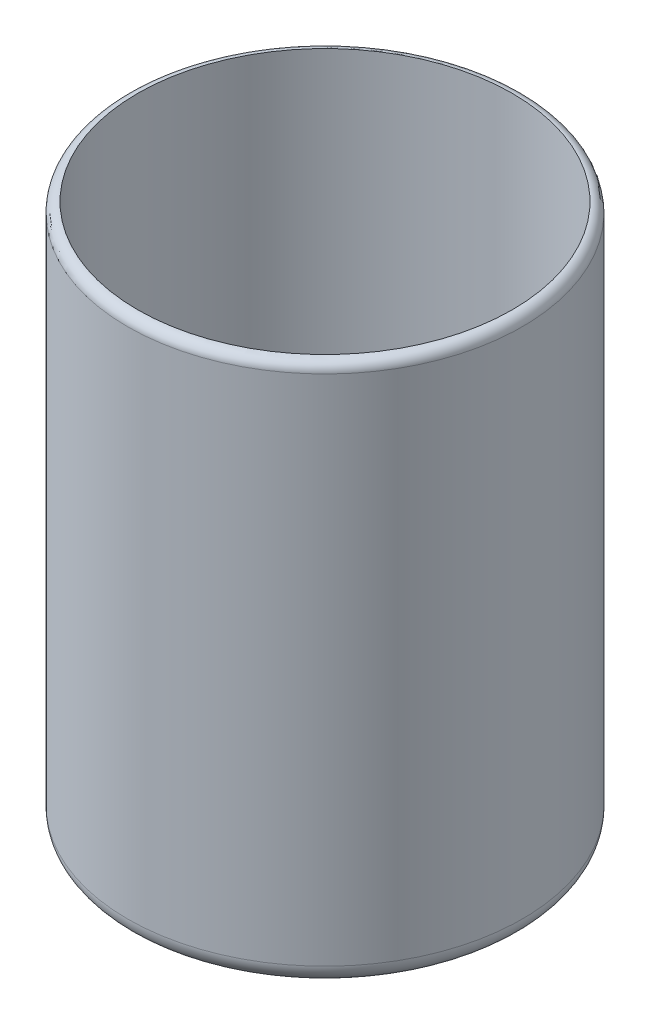
ISO-10303-21;
HEADER;
FILE_DESCRIPTION(('STEP AP214'),'2;1');
FILE_NAME('part.step','',(''),(''),'','','');
FILE_SCHEMA(('AUTOMOTIVE_DESIGN { 1 0 10303 214 1 1 1 1 }'));
ENDSEC;
DATA;
#1=APPLICATION_CONTEXT('core data for automotive mechanical design processes');
#2=APPLICATION_PROTOCOL_DEFINITION('international standard','automotive_design',2000,#1);
#3=PRODUCT_CONTEXT('',#1,'mechanical');
#4=PRODUCT('Part','Part','',(#3));
#5=PRODUCT_RELATED_PRODUCT_CATEGORY('part','',(#4));
#6=PRODUCT_DEFINITION_FORMATION('','',#4);
#7=PRODUCT_DEFINITION_CONTEXT('part definition',#1,'design');
#8=PRODUCT_DEFINITION('design','',#6,#7);
#9=PRODUCT_DEFINITION_SHAPE('','',#8);
#10=(LENGTH_UNIT() NAMED_UNIT(*) SI_UNIT(.MILLI.,.METRE.));
#11=(NAMED_UNIT(*) PLANE_ANGLE_UNIT() SI_UNIT($,.RADIAN.));
#12=(NAMED_UNIT(*) SI_UNIT($,.STERADIAN.) SOLID_ANGLE_UNIT());
#13=UNCERTAINTY_MEASURE_WITH_UNIT(LENGTH_MEASURE(1.E-05),#10,'distance_accuracy_value','');
#14=(GEOMETRIC_REPRESENTATION_CONTEXT(3) GLOBAL_UNCERTAINTY_ASSIGNED_CONTEXT((#13)) GLOBAL_UNIT_ASSIGNED_CONTEXT((#10,
#11,#12)) REPRESENTATION_CONTEXT('',''));
#15=CARTESIAN_POINT('',(0.,0.,0.));
#16=DIRECTION('',(0.,0.,1.));
#17=DIRECTION('',(1.,0.,0.));
#18=AXIS2_PLACEMENT_3D('',#15,#16,#17);
#19=CARTESIAN_POINT('',(0.,54.,0.));
#20=DIRECTION('',(0.,1.,0.));
#21=DIRECTION('',(0.,0.,1.));
#22=AXIS2_PLACEMENT_3D('',#19,#20,#21);
#23=TOROIDAL_SURFACE('',#22,19.,1.);
#24=CARTESIAN_POINT('',(0.,55.,0.));
#25=DIRECTION('',(0.,1.,0.));
#26=DIRECTION('',(0.,0.,1.));
#27=AXIS2_PLACEMENT_3D('',#24,#25,#26);
#28=CIRCLE('',#27,19.);
#29=CARTESIAN_POINT('',(0.,55.,19.));
#30=VERTEX_POINT('',#29);
#31=EDGE_CURVE('E52',#30,#30,#28,.T.);
#32=ORIENTED_EDGE('',*,*,#31,.F.);
#33=EDGE_LOOP('',(#32));
#34=FACE_BOUND('',#33,.T.);
#35=CARTESIAN_POINT('',(0.,54.,0.));
#36=DIRECTION('',(0.,1.,0.));
#37=DIRECTION('',(0.,0.,1.));
#38=AXIS2_PLACEMENT_3D('',#35,#36,#37);
#39=CIRCLE('',#38,20.);
#40=CARTESIAN_POINT('',(0.,54.,20.));
#41=VERTEX_POINT('',#40);
#42=EDGE_CURVE('E10',#41,#41,#39,.F.);
#43=ORIENTED_EDGE('',*,*,#42,.F.);
#44=EDGE_LOOP('',(#43));
#45=FACE_BOUND('',#44,.T.);
#46=ADVANCED_FACE('F38',(#34,#45),#23,.T.);
#47=CARTESIAN_POINT('',(0.,55.,0.));
#48=DIRECTION('',(0.,-1.,0.));
#49=DIRECTION('',(0.,0.,-1.));
#50=AXIS2_PLACEMENT_3D('',#47,#48,#49);
#51=CYLINDRICAL_SURFACE('',#50,20.);
#52=ORIENTED_EDGE('',*,*,#42,.T.);
#53=EDGE_LOOP('',(#52));
#54=FACE_BOUND('',#53,.T.);
#55=CARTESIAN_POINT('',(0.,2.,0.));
#56=DIRECTION('',(0.,1.,0.));
#57=DIRECTION('',(0.,0.,1.));
#58=AXIS2_PLACEMENT_3D('',#55,#56,#57);
#59=CIRCLE('',#58,20.);
#60=CARTESIAN_POINT('',(0.,2.,20.));
#61=VERTEX_POINT('',#60);
#62=EDGE_CURVE('E48',#61,#61,#59,.T.);
#63=ORIENTED_EDGE('',*,*,#62,.T.);
#64=EDGE_LOOP('',(#63));
#65=FACE_BOUND('',#64,.T.);
#66=ADVANCED_FACE('F74',(#54,#65),#51,.T.);
#67=CARTESIAN_POINT('',(0.,0.,0.));
#68=DIRECTION('',(0.,1.,0.));
#69=DIRECTION('',(0.,0.,1.));
#70=AXIS2_PLACEMENT_3D('',#67,#68,#69);
#71=PLANE('',#70);
#72=CARTESIAN_POINT('',(0.,0.,0.));
#73=DIRECTION('',(0.,1.,0.));
#74=DIRECTION('',(0.,0.,1.));
#75=AXIS2_PLACEMENT_3D('',#72,#73,#74);
#76=CIRCLE('',#75,18.);
#77=CARTESIAN_POINT('',(0.,0.,18.));
#78=VERTEX_POINT('',#77);
#79=EDGE_CURVE('E44',#78,#78,#76,.F.);
#80=ORIENTED_EDGE('',*,*,#79,.T.);
#81=EDGE_LOOP('',(#80));
#82=FACE_BOUND('',#81,.T.);
#83=ADVANCED_FACE('F65',(#82),#71,.F.);
#84=CARTESIAN_POINT('',(0.,55.,0.));
#85=DIRECTION('',(0.,-1.,0.));
#86=DIRECTION('',(0.,0.,-1.));
#87=AXIS2_PLACEMENT_3D('',#84,#85,#86);
#88=CYLINDRICAL_SURFACE('',#87,19.);
#89=ORIENTED_EDGE('',*,*,#31,.T.);
#90=EDGE_LOOP('',(#89));
#91=FACE_BOUND('',#90,.T.);
#92=CARTESIAN_POINT('',(0.,1.,0.));
#93=DIRECTION('',(0.,1.,0.));
#94=DIRECTION('',(0.,0.,1.));
#95=AXIS2_PLACEMENT_3D('',#92,#93,#94);
#96=CIRCLE('',#95,19.);
#97=CARTESIAN_POINT('',(0.,1.,19.));
#98=VERTEX_POINT('',#97);
#99=EDGE_CURVE('E57',#98,#98,#96,.T.);
#100=ORIENTED_EDGE('',*,*,#99,.F.);
#101=EDGE_LOOP('',(#100));
#102=FACE_BOUND('',#101,.T.);
#103=ADVANCED_FACE('F63',(#91,#102),#88,.F.);
#104=CARTESIAN_POINT('',(0.,1.,0.));
#105=DIRECTION('',(0.,1.,0.));
#106=DIRECTION('',(0.,0.,1.));
#107=AXIS2_PLACEMENT_3D('',#104,#105,#106);
#108=PLANE('',#107);
#109=ORIENTED_EDGE('',*,*,#99,.T.);
#110=EDGE_LOOP('',(#109));
#111=FACE_BOUND('',#110,.T.);
#112=ADVANCED_FACE('F61',(#111),#108,.T.);
#113=CARTESIAN_POINT('',(0.,2.,0.));
#114=DIRECTION('',(0.,1.,0.));
#115=DIRECTION('',(0.,0.,1.));
#116=AXIS2_PLACEMENT_3D('',#113,#114,#115);
#117=TOROIDAL_SURFACE('',#116,18.,2.);
#118=ORIENTED_EDGE('',*,*,#79,.F.);
#119=EDGE_LOOP('',(#118));
#120=FACE_BOUND('',#119,.T.);
#121=ORIENTED_EDGE('',*,*,#62,.F.);
#122=EDGE_LOOP('',(#121));
#123=FACE_BOUND('',#122,.T.);
#124=ADVANCED_FACE('F72',(#120,#123),#117,.T.);
#125=CLOSED_SHELL('',(#46,#66,#83,#103,#112,#124));
#126=MANIFOLD_SOLID_BREP('B2',#125);
#127=ADVANCED_BREP_SHAPE_REPRESENTATION('',(#18,#126),#14);
#128=SHAPE_DEFINITION_REPRESENTATION(#9,#127);
ENDSEC;
END-ISO-10303-21;
